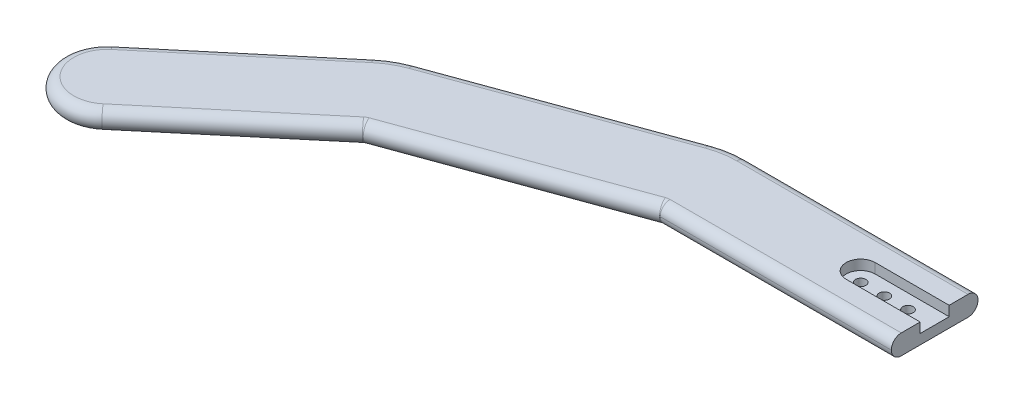
ISO-10303-21;
HEADER;
FILE_DESCRIPTION(('STEP AP214'),'2;1');
FILE_NAME('part.step','',(''),(''),'','','');
FILE_SCHEMA(('AUTOMOTIVE_DESIGN { 1 0 10303 214 1 1 1 1 }'));
ENDSEC;
DATA;
#1=APPLICATION_CONTEXT('core data for automotive mechanical design processes');
#2=APPLICATION_PROTOCOL_DEFINITION('international standard','automotive_design',2000,#1);
#3=PRODUCT_CONTEXT('',#1,'mechanical');
#4=PRODUCT('Part','Part','',(#3));
#5=PRODUCT_RELATED_PRODUCT_CATEGORY('part','',(#4));
#6=PRODUCT_DEFINITION_FORMATION('','',#4);
#7=PRODUCT_DEFINITION_CONTEXT('part definition',#1,'design');
#8=PRODUCT_DEFINITION('design','',#6,#7);
#9=PRODUCT_DEFINITION_SHAPE('','',#8);
#10=(LENGTH_UNIT() NAMED_UNIT(*) SI_UNIT(.MILLI.,.METRE.));
#11=(NAMED_UNIT(*) PLANE_ANGLE_UNIT() SI_UNIT($,.RADIAN.));
#12=(NAMED_UNIT(*) SI_UNIT($,.STERADIAN.) SOLID_ANGLE_UNIT());
#13=UNCERTAINTY_MEASURE_WITH_UNIT(LENGTH_MEASURE(1.E-05),#10,'distance_accuracy_value','');
#14=(GEOMETRIC_REPRESENTATION_CONTEXT(3) GLOBAL_UNCERTAINTY_ASSIGNED_CONTEXT((#13)) GLOBAL_UNIT_ASSIGNED_CONTEXT((#10,
#11,#12)) REPRESENTATION_CONTEXT('',''));
#15=CARTESIAN_POINT('',(0.,0.,0.));
#16=DIRECTION('',(0.,0.,1.));
#17=DIRECTION('',(1.,0.,0.));
#18=AXIS2_PLACEMENT_3D('',#15,#16,#17);
#19=CARTESIAN_POINT('',(0.,1.0922,0.));
#20=DIRECTION('',(0.,-1.,0.));
#21=DIRECTION('',(0.,0.,-1.));
#22=AXIS2_PLACEMENT_3D('',#19,#20,#21);
#23=PLANE('',#22);
#24=CARTESIAN_POINT('',(-2.928,1.0922,4.7625));
#25=DIRECTION('',(0.,1.,0.));
#26=DIRECTION('',(0.,0.,1.));
#27=AXIS2_PLACEMENT_3D('',#24,#25,#26);
#28=CIRCLE('',#27,0.575);
#29=CARTESIAN_POINT('',(-2.928,1.0922,5.3375));
#30=VERTEX_POINT('',#29);
#31=EDGE_CURVE('E245',#30,#30,#28,.T.);
#32=ORIENTED_EDGE('',*,*,#31,.F.);
#33=EDGE_LOOP('',(#32));
#34=FACE_BOUND('',#33,.T.);
#35=CARTESIAN_POINT('',(-5.528,1.0922,4.7625));
#36=DIRECTION('',(0.,1.,0.));
#37=DIRECTION('',(0.,0.,1.));
#38=AXIS2_PLACEMENT_3D('',#35,#36,#37);
#39=CIRCLE('',#38,0.575);
#40=CARTESIAN_POINT('',(-5.528,1.0922,5.3375));
#41=VERTEX_POINT('',#40);
#42=EDGE_CURVE('E249',#41,#41,#39,.T.);
#43=ORIENTED_EDGE('',*,*,#42,.F.);
#44=EDGE_LOOP('',(#43));
#45=FACE_BOUND('',#44,.T.);
#46=CARTESIAN_POINT('',(-8.128,1.0922,4.7625));
#47=DIRECTION('',(0.,1.,0.));
#48=DIRECTION('',(0.,0.,1.));
#49=AXIS2_PLACEMENT_3D('',#46,#47,#48);
#50=CIRCLE('',#49,0.575);
#51=CARTESIAN_POINT('',(-8.128,1.0922,5.3375));
#52=VERTEX_POINT('',#51);
#53=EDGE_CURVE('E255',#52,#52,#50,.T.);
#54=ORIENTED_EDGE('',*,*,#53,.F.);
#55=EDGE_LOOP('',(#54));
#56=FACE_BOUND('',#55,.T.);
#57=DIRECTION('',(-1.,0.,0.));
#58=VECTOR('',#57,1.);
#59=CARTESIAN_POINT('',(-8.128,1.0922,6.35635));
#60=LINE('',#59,#58);
#61=CARTESIAN_POINT('',(0.,1.0922,6.35635));
#62=VERTEX_POINT('',#61);
#63=CARTESIAN_POINT('',(-8.128,1.0922,6.35635));
#64=VERTEX_POINT('',#63);
#65=EDGE_CURVE('E268',#62,#64,#60,.T.);
#66=ORIENTED_EDGE('',*,*,#65,.F.);
#67=DIRECTION('',(0.,0.,-1.));
#68=VECTOR('',#67,1.);
#69=CARTESIAN_POINT('',(0.,1.0922,0.));
#70=LINE('',#69,#68);
#71=CARTESIAN_POINT('',(0.,1.0922,3.16865));
#72=VERTEX_POINT('',#71);
#73=EDGE_CURVE('E290',#62,#72,#70,.T.);
#74=ORIENTED_EDGE('',*,*,#73,.T.);
#75=DIRECTION('',(1.,0.,0.));
#76=VECTOR('',#75,1.);
#77=CARTESIAN_POINT('',(-8.128,1.0922,3.16865));
#78=LINE('',#77,#76);
#79=CARTESIAN_POINT('',(-8.128,1.0922,3.16865));
#80=VERTEX_POINT('',#79);
#81=EDGE_CURVE('E281',#80,#72,#78,.T.);
#82=ORIENTED_EDGE('',*,*,#81,.F.);
#83=CARTESIAN_POINT('',(-8.128,1.0922,4.7625));
#84=DIRECTION('',(0.,-1.,0.));
#85=DIRECTION('',(0.,0.,1.));
#86=AXIS2_PLACEMENT_3D('',#83,#84,#85);
#87=CIRCLE('',#86,1.59385);
#88=EDGE_CURVE('E278',#64,#80,#87,.T.);
#89=ORIENTED_EDGE('',*,*,#88,.F.);
#90=EDGE_LOOP('',(#66,#74,#82,#89));
#91=FACE_BOUND('',#90,.T.);
#92=ADVANCED_FACE('F35',(#34,#45,#56,#91),#23,.F.);
#93=CARTESIAN_POINT('',(0.,1.0922,0.));
#94=DIRECTION('',(-1.,0.,0.));
#95=DIRECTION('',(0.,0.,1.));
#96=AXIS2_PLACEMENT_3D('',#93,#94,#95);
#97=PLANE('',#96);
#98=DIRECTION('',(0.,0.,-1.));
#99=VECTOR('',#98,1.);
#100=CARTESIAN_POINT('',(0.,0.,0.));
#101=LINE('',#100,#99);
#102=CARTESIAN_POINT('',(0.,0.,8.4328));
#103=VERTEX_POINT('',#102);
#104=CARTESIAN_POINT('',(0.,0.,1.0922));
#105=VERTEX_POINT('',#104);
#106=EDGE_CURVE('E355',#103,#105,#101,.T.);
#107=ORIENTED_EDGE('',*,*,#106,.T.);
#108=CARTESIAN_POINT('',(0.,1.0922,1.0922));
#109=DIRECTION('',(-1.,0.,0.));
#110=DIRECTION('',(0.,0.,1.));
#111=AXIS2_PLACEMENT_3D('',#108,#109,#110);
#112=CIRCLE('',#111,1.0922);
#113=CARTESIAN_POINT('',(0.,1.0922,0.));
#114=VERTEX_POINT('',#113);
#115=EDGE_CURVE('E319',#105,#114,#112,.F.);
#116=ORIENTED_EDGE('',*,*,#115,.T.);
#117=CARTESIAN_POINT('',(0.,1.0922,1.0922));
#118=DIRECTION('',(-1.,0.,0.));
#119=DIRECTION('',(0.,0.,1.));
#120=AXIS2_PLACEMENT_3D('',#117,#118,#119);
#121=CIRCLE('',#120,1.0922);
#122=CARTESIAN_POINT('',(0.,2.1844,1.0922));
#123=VERTEX_POINT('',#122);
#124=EDGE_CURVE('E317',#114,#123,#121,.F.);
#125=ORIENTED_EDGE('',*,*,#124,.T.);
#126=DIRECTION('',(0.,0.,-1.));
#127=VECTOR('',#126,1.);
#128=CARTESIAN_POINT('',(0.,2.1844,0.));
#129=LINE('',#128,#127);
#130=CARTESIAN_POINT('',(0.,2.1844,3.16865));
#131=VERTEX_POINT('',#130);
#132=EDGE_CURVE('E270',#131,#123,#129,.T.);
#133=ORIENTED_EDGE('',*,*,#132,.F.);
#134=DIRECTION('',(0.,-1.,0.));
#135=VECTOR('',#134,1.);
#136=CARTESIAN_POINT('',(0.,2.1844,3.16865));
#137=LINE('',#136,#135);
#138=EDGE_CURVE('E293',#131,#72,#137,.T.);
#139=ORIENTED_EDGE('',*,*,#138,.T.);
#140=ORIENTED_EDGE('',*,*,#73,.F.);
#141=DIRECTION('',(0.,-1.,0.));
#142=VECTOR('',#141,1.);
#143=CARTESIAN_POINT('',(0.,2.1844,6.35635));
#144=LINE('',#143,#142);
#145=CARTESIAN_POINT('',(0.,2.1844,6.35635));
#146=VERTEX_POINT('',#145);
#147=EDGE_CURVE('E297',#146,#62,#144,.T.);
#148=ORIENTED_EDGE('',*,*,#147,.F.);
#149=DIRECTION('',(0.,0.,-1.));
#150=VECTOR('',#149,1.);
#151=CARTESIAN_POINT('',(0.,2.1844,6.35635));
#152=LINE('',#151,#150);
#153=CARTESIAN_POINT('',(0.,2.1844,8.4328));
#154=VERTEX_POINT('',#153);
#155=EDGE_CURVE('E273',#154,#146,#152,.T.);
#156=ORIENTED_EDGE('',*,*,#155,.F.);
#157=CARTESIAN_POINT('',(0.,1.0922,8.4328));
#158=DIRECTION('',(-1.,0.,0.));
#159=DIRECTION('',(0.,0.,1.));
#160=AXIS2_PLACEMENT_3D('',#157,#158,#159);
#161=CIRCLE('',#160,1.0922);
#162=CARTESIAN_POINT('',(0.,1.0922,9.525));
#163=VERTEX_POINT('',#162);
#164=EDGE_CURVE('E52',#154,#163,#161,.F.);
#165=ORIENTED_EDGE('',*,*,#164,.T.);
#166=CARTESIAN_POINT('',(0.,1.0922,8.4328));
#167=DIRECTION('',(-1.,0.,0.));
#168=DIRECTION('',(0.,0.,1.));
#169=AXIS2_PLACEMENT_3D('',#166,#167,#168);
#170=CIRCLE('',#169,1.0922);
#171=EDGE_CURVE('E315',#163,#103,#170,.F.);
#172=ORIENTED_EDGE('',*,*,#171,.T.);
#173=EDGE_LOOP('',(#107,#116,#125,#133,#139,#140,#148,#156,#165,#172));
#174=FACE_BOUND('',#173,.T.);
#175=ADVANCED_FACE('F374',(#174),#97,.F.);
#176=CARTESIAN_POINT('',(0.,0.,0.));
#177=DIRECTION('',(0.,-1.,0.));
#178=DIRECTION('',(0.,0.,-1.));
#179=AXIS2_PLACEMENT_3D('',#176,#177,#178);
#180=PLANE('',#179);
#181=CARTESIAN_POINT('',(-2.928,0.,4.7625));
#182=DIRECTION('',(0.,1.,0.));
#183=DIRECTION('',(0.,0.,1.));
#184=AXIS2_PLACEMENT_3D('',#181,#182,#183);
#185=CIRCLE('',#184,0.575);
#186=CARTESIAN_POINT('',(-2.928,0.,5.3375));
#187=VERTEX_POINT('',#186);
#188=EDGE_CURVE('E246',#187,#187,#185,.T.);
#189=ORIENTED_EDGE('',*,*,#188,.T.);
#190=EDGE_LOOP('',(#189));
#191=FACE_BOUND('',#190,.T.);
#192=CARTESIAN_POINT('',(-5.528,0.,4.7625));
#193=DIRECTION('',(0.,1.,0.));
#194=DIRECTION('',(0.,0.,1.));
#195=AXIS2_PLACEMENT_3D('',#192,#193,#194);
#196=CIRCLE('',#195,0.575);
#197=CARTESIAN_POINT('',(-5.528,0.,5.3375));
#198=VERTEX_POINT('',#197);
#199=EDGE_CURVE('E252',#198,#198,#196,.T.);
#200=ORIENTED_EDGE('',*,*,#199,.T.);
#201=EDGE_LOOP('',(#200));
#202=FACE_BOUND('',#201,.T.);
#203=CARTESIAN_POINT('',(-8.128,0.,4.7625));
#204=DIRECTION('',(0.,1.,0.));
#205=DIRECTION('',(0.,0.,1.));
#206=AXIS2_PLACEMENT_3D('',#203,#204,#205);
#207=CIRCLE('',#206,0.575);
#208=CARTESIAN_POINT('',(-8.128,0.,5.3375));
#209=VERTEX_POINT('',#208);
#210=EDGE_CURVE('E258',#209,#209,#207,.T.);
#211=ORIENTED_EDGE('',*,*,#210,.T.);
#212=EDGE_LOOP('',(#211));
#213=FACE_BOUND('',#212,.T.);
#214=DIRECTION('',(1.,0.,0.));
#215=VECTOR('',#214,1.);
#216=CARTESIAN_POINT('',(-25.4,0.,8.4328));
#217=LINE('',#216,#215);
#218=CARTESIAN_POINT('',(-25.4,0.,8.4328));
#219=VERTEX_POINT('',#218);
#220=EDGE_CURVE('E308',#103,#219,#217,.F.);
#221=ORIENTED_EDGE('',*,*,#220,.T.);
#222=CARTESIAN_POINT('',(-25.4,0.,9.70280000000001));
#223=DIRECTION('',(0.,-1.,0.));
#224=DIRECTION('',(0.,0.,-1.));
#225=AXIS2_PLACEMENT_3D('',#222,#223,#224);
#226=CIRCLE('',#225,1.27000000000001);
#227=CARTESIAN_POINT('',(-25.8343655820236,0.,8.5093903716019));
#228=VERTEX_POINT('',#227);
#229=EDGE_CURVE('E240',#228,#219,#226,.T.);
#230=ORIENTED_EDGE('',*,*,#229,.F.);
#231=DIRECTION('',(0.939692620785908,0.,-0.342020143325669));
#232=VECTOR('',#231,1.);
#233=CARTESIAN_POINT('',(-49.7025581499857,0.,17.1967020120739));
#234=LINE('',#233,#232);
#235=CARTESIAN_POINT('',(-49.7025581499857,0.,17.1967020120739));
#236=VERTEX_POINT('',#235);
#237=EDGE_CURVE('E224',#236,#228,#234,.T.);
#238=ORIENTED_EDGE('',*,*,#237,.F.);
#239=CARTESIAN_POINT('',(-49.2681925679621,0.,18.390111640472));
#240=DIRECTION('',(0.,-1.,0.));
#241=DIRECTION('',(0.,0.,-1.));
#242=AXIS2_PLACEMENT_3D('',#239,#240,#241);
#243=CIRCLE('',#242,1.27);
#244=CARTESIAN_POINT('',(-50.084532832264,0.,17.4172351977109));
#245=VERTEX_POINT('',#244);
#246=EDGE_CURVE('E207',#245,#236,#243,.T.);
#247=ORIENTED_EDGE('',*,*,#246,.F.);
#248=DIRECTION('',(0.766044443118977,0.,-0.64278760968654));
#249=VECTOR('',#248,1.);
#250=CARTESIAN_POINT('',(-65.6505559164416,0.,30.4786794265414));
#251=LINE('',#250,#249);
#252=CARTESIAN_POINT('',(-65.6505559164416,0.,30.4786794265414));
#253=VERTEX_POINT('',#252);
#254=EDGE_CURVE('E172',#253,#245,#251,.T.);
#255=ORIENTED_EDGE('',*,*,#254,.F.);
#256=CARTESIAN_POINT('',(-68.0097792802742,0.,27.6670665069619));
#257=DIRECTION('',(0.,1.,0.));
#258=DIRECTION('',(0.,0.,1.));
#259=AXIS2_PLACEMENT_3D('',#256,#257,#258);
#260=CIRCLE('',#259,3.6703);
#261=CARTESIAN_POINT('',(-70.3690026441067,0.,24.8554535873823));
#262=VERTEX_POINT('',#261);
#263=EDGE_CURVE('E175',#262,#253,#260,.T.);
#264=ORIENTED_EDGE('',*,*,#263,.F.);
#265=DIRECTION('',(0.766044443118977,0.,-0.64278760968654));
#266=VECTOR('',#265,1.);
#267=CARTESIAN_POINT('',(-70.3690026441066,0.,24.8554535873823));
#268=LINE('',#267,#266);
#269=CARTESIAN_POINT('',(-54.802979559929,0.,11.7940093585517));
#270=VERTEX_POINT('',#269);
#271=EDGE_CURVE('E162',#262,#270,#268,.T.);
#272=ORIENTED_EDGE('',*,*,#271,.T.);
#273=CARTESIAN_POINT('',(-49.2681925679621,0.,18.390111640472));
#274=DIRECTION('',(0.,-1.,0.));
#275=DIRECTION('',(0.,0.,-1.));
#276=AXIS2_PLACEMENT_3D('',#273,#274,#275);
#277=CIRCLE('',#276,8.61060000000001);
#278=CARTESIAN_POINT('',(-52.2131912140821,0.,10.2987943599329));
#279=VERTEX_POINT('',#278);
#280=EDGE_CURVE('E210',#270,#279,#277,.T.);
#281=ORIENTED_EDGE('',*,*,#280,.T.);
#282=DIRECTION('',(0.939692620785908,0.,-0.342020143325669));
#283=VECTOR('',#282,1.);
#284=CARTESIAN_POINT('',(-52.2131912140821,0.,10.2987943599329));
#285=LINE('',#284,#283);
#286=CARTESIAN_POINT('',(-28.34499864612,0.,1.61148271946086));
#287=VERTEX_POINT('',#286);
#288=EDGE_CURVE('E227',#279,#287,#285,.T.);
#289=ORIENTED_EDGE('',*,*,#288,.T.);
#290=CARTESIAN_POINT('',(-25.4,0.,9.70280000000001));
#291=DIRECTION('',(0.,-1.,0.));
#292=DIRECTION('',(0.,0.,-1.));
#293=AXIS2_PLACEMENT_3D('',#290,#291,#292);
#294=CIRCLE('',#293,8.6106);
#295=CARTESIAN_POINT('',(-25.4,0.,1.0922));
#296=VERTEX_POINT('',#295);
#297=EDGE_CURVE('E242',#287,#296,#294,.T.);
#298=ORIENTED_EDGE('',*,*,#297,.T.);
#299=DIRECTION('',(-1.,0.,0.));
#300=VECTOR('',#299,1.);
#301=CARTESIAN_POINT('',(0.,0.,1.0922));
#302=LINE('',#301,#300);
#303=EDGE_CURVE('E310',#296,#105,#302,.F.);
#304=ORIENTED_EDGE('',*,*,#303,.T.);
#305=ORIENTED_EDGE('',*,*,#106,.F.);
#306=EDGE_LOOP('',(#221,#230,#238,#247,#255,#264,#272,#281,#289,#298,#304,#305));
#307=FACE_BOUND('',#306,.T.);
#308=ADVANCED_FACE('F177',(#191,#202,#213,#307),#180,.T.);
#309=CARTESIAN_POINT('',(-8.128,2.1844,4.7625));
#310=DIRECTION('',(0.,-1.,0.));
#311=DIRECTION('',(0.,0.,-1.));
#312=AXIS2_PLACEMENT_3D('',#309,#310,#311);
#313=CYLINDRICAL_SURFACE('',#312,1.59385);
#314=ORIENTED_EDGE('',*,*,#88,.T.);
#315=DIRECTION('',(0.,-1.,0.));
#316=VECTOR('',#315,1.);
#317=CARTESIAN_POINT('',(-8.128,2.1844,3.16865));
#318=LINE('',#317,#316);
#319=CARTESIAN_POINT('',(-8.128,2.1844,3.16865));
#320=VERTEX_POINT('',#319);
#321=EDGE_CURVE('E296',#320,#80,#318,.T.);
#322=ORIENTED_EDGE('',*,*,#321,.F.);
#323=CARTESIAN_POINT('',(-8.128,2.1844,4.7625));
#324=DIRECTION('',(0.,-1.,0.));
#325=DIRECTION('',(0.,0.,1.));
#326=AXIS2_PLACEMENT_3D('',#323,#324,#325);
#327=CIRCLE('',#326,1.59385);
#328=CARTESIAN_POINT('',(-8.128,2.1844,6.35635));
#329=VERTEX_POINT('',#328);
#330=EDGE_CURVE('E264',#329,#320,#327,.T.);
#331=ORIENTED_EDGE('',*,*,#330,.F.);
#332=DIRECTION('',(0.,-1.,0.));
#333=VECTOR('',#332,1.);
#334=CARTESIAN_POINT('',(-8.128,2.1844,6.35635));
#335=LINE('',#334,#333);
#336=EDGE_CURVE('E277',#329,#64,#335,.T.);
#337=ORIENTED_EDGE('',*,*,#336,.T.);
#338=EDGE_LOOP('',(#314,#322,#331,#337));
#339=FACE_BOUND('',#338,.T.);
#340=ADVANCED_FACE('F366',(#339),#313,.F.);
#341=CARTESIAN_POINT('',(-8.128,2.1844,3.16865));
#342=DIRECTION('',(0.,0.,-1.));
#343=DIRECTION('',(-1.,0.,0.));
#344=AXIS2_PLACEMENT_3D('',#341,#342,#343);
#345=PLANE('',#344);
#346=ORIENTED_EDGE('',*,*,#81,.T.);
#347=ORIENTED_EDGE('',*,*,#138,.F.);
#348=DIRECTION('',(1.,0.,0.));
#349=VECTOR('',#348,1.);
#350=CARTESIAN_POINT('',(-8.128,2.1844,3.16865));
#351=LINE('',#350,#349);
#352=EDGE_CURVE('E267',#320,#131,#351,.T.);
#353=ORIENTED_EDGE('',*,*,#352,.F.);
#354=ORIENTED_EDGE('',*,*,#321,.T.);
#355=EDGE_LOOP('',(#346,#347,#353,#354));
#356=FACE_BOUND('',#355,.T.);
#357=ADVANCED_FACE('F361',(#356),#345,.F.);
#358=CARTESIAN_POINT('',(-8.128,2.1844,6.35635));
#359=DIRECTION('',(0.,0.,1.));
#360=DIRECTION('',(1.,0.,0.));
#361=AXIS2_PLACEMENT_3D('',#358,#359,#360);
#362=PLANE('',#361);
#363=ORIENTED_EDGE('',*,*,#65,.T.);
#364=ORIENTED_EDGE('',*,*,#336,.F.);
#365=DIRECTION('',(-1.,0.,0.));
#366=VECTOR('',#365,1.);
#367=CARTESIAN_POINT('',(-8.128,2.1844,6.35635));
#368=LINE('',#367,#366);
#369=EDGE_CURVE('E275',#146,#329,#368,.T.);
#370=ORIENTED_EDGE('',*,*,#369,.F.);
#371=ORIENTED_EDGE('',*,*,#147,.T.);
#372=EDGE_LOOP('',(#363,#364,#370,#371));
#373=FACE_BOUND('',#372,.T.);
#374=ADVANCED_FACE('F371',(#373),#362,.F.);
#375=CARTESIAN_POINT('',(-8.128,2.1844,4.7625));
#376=DIRECTION('',(0.,1.,0.));
#377=DIRECTION('',(0.,0.,1.));
#378=AXIS2_PLACEMENT_3D('',#375,#376,#377);
#379=PLANE('',#378);
#380=ORIENTED_EDGE('',*,*,#132,.T.);
#381=DIRECTION('',(-1.,0.,0.));
#382=VECTOR('',#381,1.);
#383=CARTESIAN_POINT('',(-25.4,2.1844,1.0922));
#384=LINE('',#383,#382);
#385=CARTESIAN_POINT('',(-25.4,2.1844,1.09220000000001));
#386=VERTEX_POINT('',#385);
#387=EDGE_CURVE('E11',#123,#386,#384,.T.);
#388=ORIENTED_EDGE('',*,*,#387,.T.);
#389=CARTESIAN_POINT('',(-25.4,2.1844,9.70280000000001));
#390=DIRECTION('',(0.,-1.,0.));
#391=DIRECTION('',(0.,0.,-1.));
#392=AXIS2_PLACEMENT_3D('',#389,#390,#391);
#393=CIRCLE('',#392,8.6106);
#394=CARTESIAN_POINT('',(-28.34499864612,2.1844,1.61148271946087));
#395=VERTEX_POINT('',#394);
#396=EDGE_CURVE('E236',#395,#386,#393,.T.);
#397=ORIENTED_EDGE('',*,*,#396,.F.);
#398=DIRECTION('',(0.939692620785908,0.,-0.342020143325669));
#399=VECTOR('',#398,1.);
#400=CARTESIAN_POINT('',(-52.2131912140821,2.1844,10.2987943599329));
#401=LINE('',#400,#399);
#402=CARTESIAN_POINT('',(-52.2131912140821,2.1844,10.2987943599329));
#403=VERTEX_POINT('',#402);
#404=EDGE_CURVE('E218',#403,#395,#401,.T.);
#405=ORIENTED_EDGE('',*,*,#404,.F.);
#406=CARTESIAN_POINT('',(-49.2681925679621,2.1844,18.390111640472));
#407=DIRECTION('',(0.,-1.,0.));
#408=DIRECTION('',(0.,0.,-1.));
#409=AXIS2_PLACEMENT_3D('',#406,#407,#408);
#410=CIRCLE('',#409,8.6106);
#411=CARTESIAN_POINT('',(-54.802979559929,2.1844,11.7940093585518));
#412=VERTEX_POINT('',#411);
#413=EDGE_CURVE('E201',#412,#403,#410,.T.);
#414=ORIENTED_EDGE('',*,*,#413,.F.);
#415=DIRECTION('',(0.766044443118977,0.,-0.64278760968654));
#416=VECTOR('',#415,1.);
#417=CARTESIAN_POINT('',(-70.3690026441066,2.1844,24.8554535873823));
#418=LINE('',#417,#416);
#419=CARTESIAN_POINT('',(-70.3690026441066,2.1844,24.8554535873823));
#420=VERTEX_POINT('',#419);
#421=EDGE_CURVE('E188',#420,#412,#418,.T.);
#422=ORIENTED_EDGE('',*,*,#421,.F.);
#423=CARTESIAN_POINT('',(-68.0097792802742,2.1844,27.6670665069619));
#424=DIRECTION('',(0.,1.,0.));
#425=DIRECTION('',(0.,0.,1.));
#426=AXIS2_PLACEMENT_3D('',#423,#424,#425);
#427=CIRCLE('',#426,3.6703);
#428=CARTESIAN_POINT('',(-65.6505559164416,2.1844,30.4786794265414));
#429=VERTEX_POINT('',#428);
#430=EDGE_CURVE('E182',#420,#429,#427,.T.);
#431=ORIENTED_EDGE('',*,*,#430,.T.);
#432=DIRECTION('',(0.766044443118977,0.,-0.64278760968654));
#433=VECTOR('',#432,1.);
#434=CARTESIAN_POINT('',(-65.6505559164416,2.1844,30.4786794265414));
#435=LINE('',#434,#433);
#436=CARTESIAN_POINT('',(-50.084532832264,2.1844,17.4172351977109));
#437=VERTEX_POINT('',#436);
#438=EDGE_CURVE('E193',#429,#437,#435,.T.);
#439=ORIENTED_EDGE('',*,*,#438,.T.);
#440=CARTESIAN_POINT('',(-49.2681925679621,2.1844,18.390111640472));
#441=DIRECTION('',(0.,-1.,0.));
#442=DIRECTION('',(0.,0.,-1.));
#443=AXIS2_PLACEMENT_3D('',#440,#441,#442);
#444=CIRCLE('',#443,1.27);
#445=CARTESIAN_POINT('',(-49.7025581499857,2.1844,17.1967020120739));
#446=VERTEX_POINT('',#445);
#447=EDGE_CURVE('E204',#437,#446,#444,.T.);
#448=ORIENTED_EDGE('',*,*,#447,.T.);
#449=DIRECTION('',(0.939692620785908,0.,-0.342020143325669));
#450=VECTOR('',#449,1.);
#451=CARTESIAN_POINT('',(-49.7025581499857,2.1844,17.1967020120739));
#452=LINE('',#451,#450);
#453=CARTESIAN_POINT('',(-25.8343655820236,2.1844,8.5093903716019));
#454=VERTEX_POINT('',#453);
#455=EDGE_CURVE('E221',#446,#454,#452,.T.);
#456=ORIENTED_EDGE('',*,*,#455,.T.);
#457=CARTESIAN_POINT('',(-25.4,2.1844,9.70280000000001));
#458=DIRECTION('',(0.,-1.,0.));
#459=DIRECTION('',(0.,0.,-1.));
#460=AXIS2_PLACEMENT_3D('',#457,#458,#459);
#461=CIRCLE('',#460,1.27);
#462=CARTESIAN_POINT('',(-25.4,2.1844,8.4328));
#463=VERTEX_POINT('',#462);
#464=EDGE_CURVE('E238',#454,#463,#461,.T.);
#465=ORIENTED_EDGE('',*,*,#464,.T.);
#466=DIRECTION('',(1.,0.,0.));
#467=VECTOR('',#466,1.);
#468=CARTESIAN_POINT('',(0.,2.1844,8.4328));
#469=LINE('',#468,#467);
#470=EDGE_CURVE('E44',#463,#154,#469,.T.);
#471=ORIENTED_EDGE('',*,*,#470,.T.);
#472=ORIENTED_EDGE('',*,*,#155,.T.);
#473=ORIENTED_EDGE('',*,*,#369,.T.);
#474=ORIENTED_EDGE('',*,*,#330,.T.);
#475=ORIENTED_EDGE('',*,*,#352,.T.);
#476=EDGE_LOOP('',(#380,#388,#397,#405,#414,#422,#431,#439,#448,#456,#465,#471,#472,#473,#474,#475));
#477=FACE_BOUND('',#476,.T.);
#478=ADVANCED_FACE('F378',(#477),#379,.T.);
#479=CARTESIAN_POINT('',(-8.128,1.0922,1.0922));
#480=DIRECTION('',(1.,0.,0.));
#481=DIRECTION('',(0.,0.,-1.));
#482=AXIS2_PLACEMENT_3D('',#479,#480,#481);
#483=CYLINDRICAL_SURFACE('',#482,1.0922);
#484=ORIENTED_EDGE('',*,*,#387,.F.);
#485=ORIENTED_EDGE('',*,*,#124,.F.);
#486=DIRECTION('',(-1.,0.,0.));
#487=VECTOR('',#486,1.);
#488=CARTESIAN_POINT('',(0.,1.0922,0.));
#489=LINE('',#488,#487);
#490=CARTESIAN_POINT('',(-25.4,1.0922,0.));
#491=VERTEX_POINT('',#490);
#492=EDGE_CURVE('E282',#491,#114,#489,.F.);
#493=ORIENTED_EDGE('',*,*,#492,.F.);
#494=CARTESIAN_POINT('',(-25.4,1.0922,1.0922));
#495=DIRECTION('',(1.,0.,0.));
#496=DIRECTION('',(0.,0.,-1.));
#497=AXIS2_PLACEMENT_3D('',#494,#495,#496);
#498=CIRCLE('',#497,1.0922);
#499=EDGE_CURVE('E322',#386,#491,#498,.F.);
#500=ORIENTED_EDGE('',*,*,#499,.F.);
#501=EDGE_LOOP('',(#484,#485,#493,#500));
#502=FACE_BOUND('',#501,.T.);
#503=ADVANCED_FACE('F382',(#502),#483,.T.);
#504=CARTESIAN_POINT('',(0.,1.0922,1.0922));
#505=DIRECTION('',(1.,0.,0.));
#506=DIRECTION('',(0.,0.,-1.));
#507=AXIS2_PLACEMENT_3D('',#504,#505,#506);
#508=CYLINDRICAL_SURFACE('',#507,1.0922);
#509=ORIENTED_EDGE('',*,*,#115,.F.);
#510=ORIENTED_EDGE('',*,*,#303,.F.);
#511=CARTESIAN_POINT('',(-25.4,1.0922,1.0922));
#512=DIRECTION('',(1.,0.,0.));
#513=DIRECTION('',(0.,0.,-1.));
#514=AXIS2_PLACEMENT_3D('',#511,#512,#513);
#515=CIRCLE('',#514,1.0922);
#516=EDGE_CURVE('E311',#491,#296,#515,.F.);
#517=ORIENTED_EDGE('',*,*,#516,.F.);
#518=ORIENTED_EDGE('',*,*,#492,.T.);
#519=EDGE_LOOP('',(#509,#510,#517,#518));
#520=FACE_BOUND('',#519,.T.);
#521=ADVANCED_FACE('F424',(#520),#508,.T.);
#522=CARTESIAN_POINT('',(-8.128,1.0922,8.4328));
#523=DIRECTION('',(-1.,0.,0.));
#524=DIRECTION('',(0.,0.,1.));
#525=AXIS2_PLACEMENT_3D('',#522,#523,#524);
#526=CYLINDRICAL_SURFACE('',#525,1.0922);
#527=ORIENTED_EDGE('',*,*,#470,.F.);
#528=CARTESIAN_POINT('',(-25.4,1.0922,8.4328));
#529=DIRECTION('',(1.,0.,0.));
#530=DIRECTION('',(0.,0.,-1.));
#531=AXIS2_PLACEMENT_3D('',#528,#529,#530);
#532=CIRCLE('',#531,1.0922);
#533=CARTESIAN_POINT('',(-25.4,1.0922,9.525));
#534=VERTEX_POINT('',#533);
#535=EDGE_CURVE('E335',#534,#463,#532,.F.);
#536=ORIENTED_EDGE('',*,*,#535,.F.);
#537=DIRECTION('',(1.,0.,0.));
#538=VECTOR('',#537,1.);
#539=CARTESIAN_POINT('',(-25.4,1.0922,9.525));
#540=LINE('',#539,#538);
#541=EDGE_CURVE('E261',#163,#534,#540,.F.);
#542=ORIENTED_EDGE('',*,*,#541,.F.);
#543=ORIENTED_EDGE('',*,*,#164,.F.);
#544=EDGE_LOOP('',(#527,#536,#542,#543));
#545=FACE_BOUND('',#544,.T.);
#546=ADVANCED_FACE('F37',(#545),#526,.T.);
#547=CARTESIAN_POINT('',(0.,1.0922,8.4328));
#548=DIRECTION('',(-1.,0.,0.));
#549=DIRECTION('',(0.,0.,1.));
#550=AXIS2_PLACEMENT_3D('',#547,#548,#549);
#551=CYLINDRICAL_SURFACE('',#550,1.0922);
#552=CARTESIAN_POINT('',(-25.4,1.0922,8.4328));
#553=DIRECTION('',(1.,0.,0.));
#554=DIRECTION('',(0.,0.,-1.));
#555=AXIS2_PLACEMENT_3D('',#552,#553,#554);
#556=CIRCLE('',#555,1.0922);
#557=EDGE_CURVE('E324',#219,#534,#556,.F.);
#558=ORIENTED_EDGE('',*,*,#557,.F.);
#559=ORIENTED_EDGE('',*,*,#220,.F.);
#560=ORIENTED_EDGE('',*,*,#171,.F.);
#561=ORIENTED_EDGE('',*,*,#541,.T.);
#562=EDGE_LOOP('',(#558,#559,#560,#561));
#563=FACE_BOUND('',#562,.T.);
#564=ADVANCED_FACE('F345',(#563),#551,.T.);
#565=CARTESIAN_POINT('',(-8.128,0.,4.7625));
#566=DIRECTION('',(0.,1.,0.));
#567=DIRECTION('',(0.,0.,1.));
#568=AXIS2_PLACEMENT_3D('',#565,#566,#567);
#569=CYLINDRICAL_SURFACE('',#568,0.575);
#570=ORIENTED_EDGE('',*,*,#210,.F.);
#571=EDGE_LOOP('',(#570));
#572=FACE_BOUND('',#571,.T.);
#573=ORIENTED_EDGE('',*,*,#53,.T.);
#574=EDGE_LOOP('',(#573));
#575=FACE_BOUND('',#574,.T.);
#576=ADVANCED_FACE('F430',(#572,#575),#569,.F.);
#577=CARTESIAN_POINT('',(-5.528,0.,4.7625));
#578=DIRECTION('',(0.,1.,0.));
#579=DIRECTION('',(0.,0.,1.));
#580=AXIS2_PLACEMENT_3D('',#577,#578,#579);
#581=CYLINDRICAL_SURFACE('',#580,0.575);
#582=ORIENTED_EDGE('',*,*,#199,.F.);
#583=EDGE_LOOP('',(#582));
#584=FACE_BOUND('',#583,.T.);
#585=ORIENTED_EDGE('',*,*,#42,.T.);
#586=EDGE_LOOP('',(#585));
#587=FACE_BOUND('',#586,.T.);
#588=ADVANCED_FACE('F435',(#584,#587),#581,.F.);
#589=CARTESIAN_POINT('',(-2.928,0.,4.7625));
#590=DIRECTION('',(0.,1.,0.));
#591=DIRECTION('',(0.,0.,1.));
#592=AXIS2_PLACEMENT_3D('',#589,#590,#591);
#593=CYLINDRICAL_SURFACE('',#592,0.575);
#594=ORIENTED_EDGE('',*,*,#188,.F.);
#595=EDGE_LOOP('',(#594));
#596=FACE_BOUND('',#595,.T.);
#597=ORIENTED_EDGE('',*,*,#31,.T.);
#598=EDGE_LOOP('',(#597));
#599=FACE_BOUND('',#598,.T.);
#600=ADVANCED_FACE('F502',(#596,#599),#593,.F.);
#601=CARTESIAN_POINT('',(-25.4,1.0922,9.70280000000001));
#602=DIRECTION('',(0.,-1.,0.));
#603=DIRECTION('',(0.,0.,-1.));
#604=AXIS2_PLACEMENT_3D('',#601,#602,#603);
#605=TOROIDAL_SURFACE('',#604,8.6106,1.0922);
#606=ORIENTED_EDGE('',*,*,#297,.F.);
#607=CARTESIAN_POINT('',(-28.34499864612,1.0922,1.61148271946086));
#608=DIRECTION('',(-0.939692620785908,0.,0.342020143325669));
#609=DIRECTION('',(0.342020143325669,0.,0.939692620785908));
#610=AXIS2_PLACEMENT_3D('',#607,#608,#609);
#611=CIRCLE('',#610,1.0922);
#612=EDGE_CURVE('E230',#395,#287,#611,.T.);
#613=ORIENTED_EDGE('',*,*,#612,.F.);
#614=ORIENTED_EDGE('',*,*,#396,.T.);
#615=ORIENTED_EDGE('',*,*,#499,.T.);
#616=ORIENTED_EDGE('',*,*,#516,.T.);
#617=EDGE_LOOP('',(#606,#613,#614,#615,#616));
#618=FACE_BOUND('',#617,.T.);
#619=ADVANCED_FACE('F386',(#618),#605,.T.);
#620=CARTESIAN_POINT('',(-25.4,1.0922,9.70280000000001));
#621=DIRECTION('',(0.,-1.,0.));
#622=DIRECTION('',(0.,0.,-1.));
#623=AXIS2_PLACEMENT_3D('',#620,#621,#622);
#624=TOROIDAL_SURFACE('',#623,1.27,1.0922);
#625=ORIENTED_EDGE('',*,*,#464,.F.);
#626=CARTESIAN_POINT('',(-25.8343655820236,1.0922,8.5093903716019));
#627=DIRECTION('',(-0.939692620785908,0.,0.342020143325669));
#628=DIRECTION('',(0.342020143325669,0.,0.939692620785908));
#629=AXIS2_PLACEMENT_3D('',#626,#627,#628);
#630=CIRCLE('',#629,1.0922);
#631=EDGE_CURVE('E233',#228,#454,#630,.T.);
#632=ORIENTED_EDGE('',*,*,#631,.F.);
#633=ORIENTED_EDGE('',*,*,#229,.T.);
#634=ORIENTED_EDGE('',*,*,#557,.T.);
#635=ORIENTED_EDGE('',*,*,#535,.T.);
#636=EDGE_LOOP('',(#625,#632,#633,#634,#635));
#637=FACE_BOUND('',#636,.T.);
#638=ADVANCED_FACE('F350',(#637),#624,.T.);
#639=CARTESIAN_POINT('',(-52.2131912140821,1.0922,10.2987943599329));
#640=DIRECTION('',(0.939692620785908,0.,-0.342020143325669));
#641=DIRECTION('',(-0.342020143325669,0.,-0.939692620785908));
#642=AXIS2_PLACEMENT_3D('',#639,#640,#641);
#643=CYLINDRICAL_SURFACE('',#642,1.0922);
#644=ORIENTED_EDGE('',*,*,#612,.T.);
#645=ORIENTED_EDGE('',*,*,#288,.F.);
#646=CARTESIAN_POINT('',(-52.2131912140821,1.0922,10.2987943599329));
#647=DIRECTION('',(-0.939692620785908,0.,0.342020143325669));
#648=DIRECTION('',(0.342020143325669,0.,0.939692620785908));
#649=AXIS2_PLACEMENT_3D('',#646,#647,#648);
#650=CIRCLE('',#649,1.0922);
#651=EDGE_CURVE('E212',#403,#279,#650,.T.);
#652=ORIENTED_EDGE('',*,*,#651,.F.);
#653=ORIENTED_EDGE('',*,*,#404,.T.);
#654=EDGE_LOOP('',(#644,#645,#652,#653));
#655=FACE_BOUND('',#654,.T.);
#656=ADVANCED_FACE('F390',(#655),#643,.T.);
#657=CARTESIAN_POINT('',(-49.7025581499857,1.0922,17.1967020120739));
#658=DIRECTION('',(0.939692620785908,0.,-0.342020143325669));
#659=DIRECTION('',(-0.342020143325669,0.,-0.939692620785908));
#660=AXIS2_PLACEMENT_3D('',#657,#658,#659);
#661=CYLINDRICAL_SURFACE('',#660,1.0922);
#662=ORIENTED_EDGE('',*,*,#631,.T.);
#663=ORIENTED_EDGE('',*,*,#455,.F.);
#664=CARTESIAN_POINT('',(-49.7025581499857,1.0922,17.1967020120739));
#665=DIRECTION('',(-0.939692620785908,0.,0.342020143325669));
#666=DIRECTION('',(0.342020143325669,0.,0.939692620785908));
#667=AXIS2_PLACEMENT_3D('',#664,#665,#666);
#668=CIRCLE('',#667,1.0922);
#669=EDGE_CURVE('E215',#236,#446,#668,.T.);
#670=ORIENTED_EDGE('',*,*,#669,.F.);
#671=ORIENTED_EDGE('',*,*,#237,.T.);
#672=EDGE_LOOP('',(#662,#663,#670,#671));
#673=FACE_BOUND('',#672,.T.);
#674=ADVANCED_FACE('F399',(#673),#661,.T.);
#675=CARTESIAN_POINT('',(-49.2681925679621,1.0922,18.390111640472));
#676=DIRECTION('',(0.,-1.,0.));
#677=DIRECTION('',(0.,0.,-1.));
#678=AXIS2_PLACEMENT_3D('',#675,#676,#677);
#679=TOROIDAL_SURFACE('',#678,8.61060000000001,1.0922);
#680=ORIENTED_EDGE('',*,*,#280,.F.);
#681=CARTESIAN_POINT('',(-54.802979559929,1.0922,11.7940093585517));
#682=DIRECTION('',(-0.766044443118977,0.,0.64278760968654));
#683=DIRECTION('',(0.64278760968654,0.,0.766044443118977));
#684=AXIS2_PLACEMENT_3D('',#681,#682,#683);
#685=CIRCLE('',#684,1.0922);
#686=EDGE_CURVE('E169',#412,#270,#685,.T.);
#687=ORIENTED_EDGE('',*,*,#686,.F.);
#688=ORIENTED_EDGE('',*,*,#413,.T.);
#689=ORIENTED_EDGE('',*,*,#651,.T.);
#690=EDGE_LOOP('',(#680,#687,#688,#689));
#691=FACE_BOUND('',#690,.T.);
#692=ADVANCED_FACE('F392',(#691),#679,.T.);
#693=CARTESIAN_POINT('',(-49.2681925679621,1.0922,18.390111640472));
#694=DIRECTION('',(0.,-1.,0.));
#695=DIRECTION('',(0.,0.,-1.));
#696=AXIS2_PLACEMENT_3D('',#693,#694,#695);
#697=TOROIDAL_SURFACE('',#696,1.27,1.0922);
#698=ORIENTED_EDGE('',*,*,#447,.F.);
#699=CARTESIAN_POINT('',(-50.084532832264,1.0922,17.4172351977109));
#700=DIRECTION('',(-0.766044443118977,0.,0.64278760968654));
#701=DIRECTION('',(0.64278760968654,0.,0.766044443118977));
#702=AXIS2_PLACEMENT_3D('',#699,#700,#701);
#703=CIRCLE('',#702,1.0922);
#704=EDGE_CURVE('E198',#245,#437,#703,.T.);
#705=ORIENTED_EDGE('',*,*,#704,.F.);
#706=ORIENTED_EDGE('',*,*,#246,.T.);
#707=ORIENTED_EDGE('',*,*,#669,.T.);
#708=EDGE_LOOP('',(#698,#705,#706,#707));
#709=FACE_BOUND('',#708,.T.);
#710=ADVANCED_FACE('F397',(#709),#697,.T.);
#711=CARTESIAN_POINT('',(-70.3690026441066,1.0922,24.8554535873823));
#712=DIRECTION('',(0.766044443118977,0.,-0.64278760968654));
#713=DIRECTION('',(-0.642787609686541,0.,-0.766044443118977));
#714=AXIS2_PLACEMENT_3D('',#711,#712,#713);
#715=CYLINDRICAL_SURFACE('',#714,1.0922);
#716=ORIENTED_EDGE('',*,*,#686,.T.);
#717=ORIENTED_EDGE('',*,*,#271,.F.);
#718=CARTESIAN_POINT('',(-70.3690026441066,1.0922,24.8554535873823));
#719=DIRECTION('',(-0.766044443118977,0.,0.64278760968654));
#720=DIRECTION('',(0.642787609686541,0.,0.766044443118977));
#721=AXIS2_PLACEMENT_3D('',#718,#719,#720);
#722=CIRCLE('',#721,1.0922);
#723=EDGE_CURVE('E167',#420,#262,#722,.T.);
#724=ORIENTED_EDGE('',*,*,#723,.F.);
#725=ORIENTED_EDGE('',*,*,#421,.T.);
#726=EDGE_LOOP('',(#716,#717,#724,#725));
#727=FACE_BOUND('',#726,.T.);
#728=ADVANCED_FACE('F164',(#727),#715,.T.);
#729=CARTESIAN_POINT('',(-65.6505559164416,1.0922,30.4786794265414));
#730=DIRECTION('',(0.766044443118977,0.,-0.64278760968654));
#731=DIRECTION('',(-0.642787609686541,0.,-0.766044443118977));
#732=AXIS2_PLACEMENT_3D('',#729,#730,#731);
#733=CYLINDRICAL_SURFACE('',#732,1.0922);
#734=ORIENTED_EDGE('',*,*,#704,.T.);
#735=ORIENTED_EDGE('',*,*,#438,.F.);
#736=CARTESIAN_POINT('',(-65.6505559164416,1.0922,30.4786794265414));
#737=DIRECTION('',(-0.766044443118977,0.,0.64278760968654));
#738=DIRECTION('',(0.642787609686541,0.,0.766044443118977));
#739=AXIS2_PLACEMENT_3D('',#736,#737,#738);
#740=CIRCLE('',#739,1.0922);
#741=EDGE_CURVE('E186',#253,#429,#740,.T.);
#742=ORIENTED_EDGE('',*,*,#741,.F.);
#743=ORIENTED_EDGE('',*,*,#254,.T.);
#744=EDGE_LOOP('',(#734,#735,#742,#743));
#745=FACE_BOUND('',#744,.T.);
#746=ADVANCED_FACE('F394',(#745),#733,.T.);
#747=CARTESIAN_POINT('',(-68.0097792802742,1.0922,27.6670665069619));
#748=DIRECTION('',(0.,1.,0.));
#749=DIRECTION('',(0.,0.,1.));
#750=AXIS2_PLACEMENT_3D('',#747,#748,#749);
#751=TOROIDAL_SURFACE('',#750,3.6703,1.0922);
#752=ORIENTED_EDGE('',*,*,#723,.T.);
#753=ORIENTED_EDGE('',*,*,#263,.T.);
#754=ORIENTED_EDGE('',*,*,#741,.T.);
#755=ORIENTED_EDGE('',*,*,#430,.F.);
#756=EDGE_LOOP('',(#752,#753,#754,#755));
#757=FACE_BOUND('',#756,.T.);
#758=ADVANCED_FACE('F184',(#757),#751,.T.);
#759=CLOSED_SHELL('',(#92,#175,#308,#340,#357,#374,#478,#503,#521,#546,#564,#576,#588,#600,#619,
#638,#656,#674,#692,#710,#728,#746,#758));
#760=MANIFOLD_SOLID_BREP('B2',#759);
#761=ADVANCED_BREP_SHAPE_REPRESENTATION('',(#18,#760),#14);
#762=SHAPE_DEFINITION_REPRESENTATION(#9,#761);
ENDSEC;
END-ISO-10303-21;
